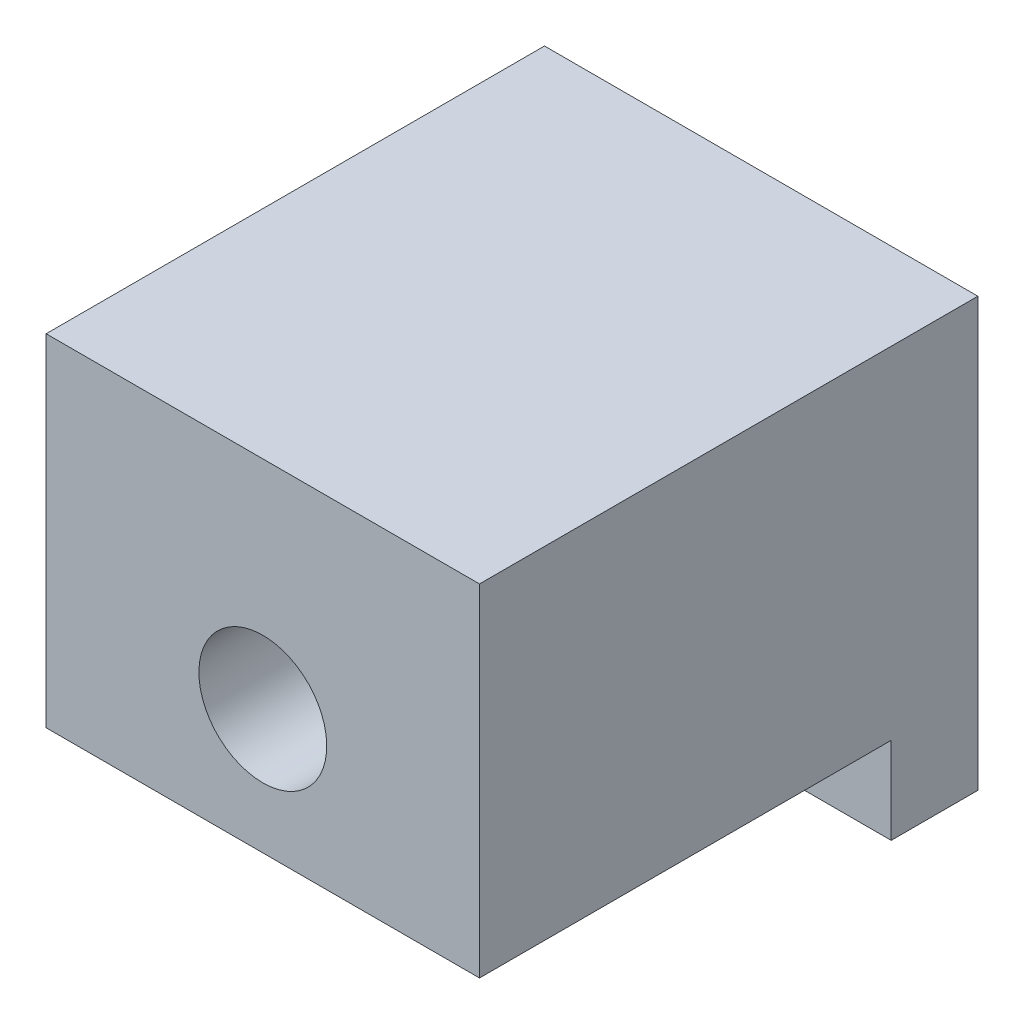
ISO-10303-21;
HEADER;
FILE_DESCRIPTION(('STEP AP214'),'2;1');
FILE_NAME('part.step','',(''),(''),'','','');
FILE_SCHEMA(('AUTOMOTIVE_DESIGN { 1 0 10303 214 1 1 1 1 }'));
ENDSEC;
DATA;
#1=APPLICATION_CONTEXT('core data for automotive mechanical design processes');
#2=APPLICATION_PROTOCOL_DEFINITION('international standard','automotive_design',2000,#1);
#3=PRODUCT_CONTEXT('',#1,'mechanical');
#4=PRODUCT('Part','Part','',(#3));
#5=PRODUCT_RELATED_PRODUCT_CATEGORY('part','',(#4));
#6=PRODUCT_DEFINITION_FORMATION('','',#4);
#7=PRODUCT_DEFINITION_CONTEXT('part definition',#1,'design');
#8=PRODUCT_DEFINITION('design','',#6,#7);
#9=PRODUCT_DEFINITION_SHAPE('','',#8);
#10=(LENGTH_UNIT() NAMED_UNIT(*) SI_UNIT(.MILLI.,.METRE.));
#11=(NAMED_UNIT(*) PLANE_ANGLE_UNIT() SI_UNIT($,.RADIAN.));
#12=(NAMED_UNIT(*) SI_UNIT($,.STERADIAN.) SOLID_ANGLE_UNIT());
#13=UNCERTAINTY_MEASURE_WITH_UNIT(LENGTH_MEASURE(1.E-05),#10,'distance_accuracy_value','');
#14=(GEOMETRIC_REPRESENTATION_CONTEXT(3) GLOBAL_UNCERTAINTY_ASSIGNED_CONTEXT((#13)) GLOBAL_UNIT_ASSIGNED_CONTEXT((#10,
#11,#12)) REPRESENTATION_CONTEXT('',''));
#15=CARTESIAN_POINT('',(0.,0.,0.));
#16=DIRECTION('',(0.,0.,1.));
#17=DIRECTION('',(1.,0.,0.));
#18=AXIS2_PLACEMENT_3D('',#15,#16,#17);
#19=CARTESIAN_POINT('',(-5.,46.5,2.));
#20=DIRECTION('',(0.,-1.,0.));
#21=DIRECTION('',(-1.,0.,0.));
#22=AXIS2_PLACEMENT_3D('',#19,#20,#21);
#23=PLANE('',#22);
#24=DIRECTION('',(1.,0.,0.));
#25=VECTOR('',#24,1.);
#26=CARTESIAN_POINT('',(-5.,46.5,11.5));
#27=LINE('',#26,#25);
#28=CARTESIAN_POINT('',(-5.,46.5,11.5));
#29=VERTEX_POINT('',#28);
#30=CARTESIAN_POINT('',(5.,46.5,11.5));
#31=VERTEX_POINT('',#30);
#32=EDGE_CURVE('E69',#29,#31,#27,.T.);
#33=ORIENTED_EDGE('',*,*,#32,.T.);
#34=DIRECTION('',(0.,0.,1.));
#35=VECTOR('',#34,1.);
#36=CARTESIAN_POINT('',(5.,46.5,2.));
#37=LINE('',#36,#35);
#38=CARTESIAN_POINT('',(5.,46.5,0.));
#39=VERTEX_POINT('',#38);
#40=EDGE_CURVE('E53',#39,#31,#37,.T.);
#41=ORIENTED_EDGE('',*,*,#40,.F.);
#42=DIRECTION('',(1.,0.,0.));
#43=VECTOR('',#42,1.);
#44=CARTESIAN_POINT('',(-5.,46.5,0.));
#45=LINE('',#44,#43);
#46=CARTESIAN_POINT('',(-5.,46.5,0.));
#47=VERTEX_POINT('',#46);
#48=EDGE_CURVE('E108',#47,#39,#45,.T.);
#49=ORIENTED_EDGE('',*,*,#48,.F.);
#50=DIRECTION('',(0.,0.,1.));
#51=VECTOR('',#50,1.);
#52=CARTESIAN_POINT('',(-5.,46.5,2.));
#53=LINE('',#52,#51);
#54=EDGE_CURVE('E11',#47,#29,#53,.T.);
#55=ORIENTED_EDGE('',*,*,#54,.T.);
#56=EDGE_LOOP('',(#33,#41,#49,#55));
#57=FACE_BOUND('',#56,.T.);
#58=ADVANCED_FACE('F44',(#57),#23,.F.);
#59=CARTESIAN_POINT('',(0.,11.5,11.5));
#60=DIRECTION('',(0.,0.,-1.));
#61=DIRECTION('',(0.,1.,0.));
#62=AXIS2_PLACEMENT_3D('',#59,#60,#61);
#63=PLANE('',#62);
#64=CARTESIAN_POINT('',(0.,41.5,11.5));
#65=DIRECTION('',(0.,0.,1.));
#66=DIRECTION('',(0.,-1.,0.));
#67=AXIS2_PLACEMENT_3D('',#64,#65,#66);
#68=CIRCLE('',#67,1.475);
#69=CARTESIAN_POINT('',(0.,40.025,11.5));
#70=VERTEX_POINT('',#69);
#71=EDGE_CURVE('E147',#70,#70,#68,.T.);
#72=ORIENTED_EDGE('',*,*,#71,.F.);
#73=EDGE_LOOP('',(#72));
#74=FACE_BOUND('',#73,.T.);
#75=DIRECTION('',(0.,1.,0.));
#76=VECTOR('',#75,1.);
#77=CARTESIAN_POINT('',(-5.,-23.5,11.5));
#78=LINE('',#77,#76);
#79=CARTESIAN_POINT('',(-5.00000000000001,38.625,11.5));
#80=VERTEX_POINT('',#79);
#81=EDGE_CURVE('E106',#80,#29,#78,.T.);
#82=ORIENTED_EDGE('',*,*,#81,.F.);
#83=DIRECTION('',(1.,0.,0.));
#84=VECTOR('',#83,1.);
#85=CARTESIAN_POINT('',(-5.00000000000001,38.625,11.5));
#86=LINE('',#85,#84);
#87=CARTESIAN_POINT('',(5.,38.625,11.5));
#88=VERTEX_POINT('',#87);
#89=EDGE_CURVE('E155',#80,#88,#86,.T.);
#90=ORIENTED_EDGE('',*,*,#89,.T.);
#91=DIRECTION('',(0.,-1.,0.));
#92=VECTOR('',#91,1.);
#93=CARTESIAN_POINT('',(5.,-23.5,11.5));
#94=LINE('',#93,#92);
#95=EDGE_CURVE('E156',#31,#88,#94,.T.);
#96=ORIENTED_EDGE('',*,*,#95,.F.);
#97=ORIENTED_EDGE('',*,*,#32,.F.);
#98=EDGE_LOOP('',(#82,#90,#96,#97));
#99=FACE_BOUND('',#98,.T.);
#100=ADVANCED_FACE('F175',(#74,#99),#63,.F.);
#101=CARTESIAN_POINT('',(-5.,-23.5,2.));
#102=DIRECTION('',(1.,0.,0.));
#103=DIRECTION('',(0.,-1.,0.));
#104=AXIS2_PLACEMENT_3D('',#101,#102,#103);
#105=PLANE('',#104);
#106=ORIENTED_EDGE('',*,*,#54,.F.);
#107=DIRECTION('',(0.,1.,0.));
#108=VECTOR('',#107,1.);
#109=CARTESIAN_POINT('',(-5.,46.5,0.));
#110=LINE('',#109,#108);
#111=CARTESIAN_POINT('',(-5.,36.625,0.));
#112=VERTEX_POINT('',#111);
#113=EDGE_CURVE('E101',#112,#47,#110,.T.);
#114=ORIENTED_EDGE('',*,*,#113,.F.);
#115=DIRECTION('',(0.,0.,1.));
#116=VECTOR('',#115,1.);
#117=CARTESIAN_POINT('',(-5.,36.625,0.));
#118=LINE('',#117,#116);
#119=CARTESIAN_POINT('',(-5.,36.625,2.));
#120=VERTEX_POINT('',#119);
#121=EDGE_CURVE('E133',#112,#120,#118,.T.);
#122=ORIENTED_EDGE('',*,*,#121,.T.);
#123=DIRECTION('',(0.,1.,0.));
#124=VECTOR('',#123,1.);
#125=CARTESIAN_POINT('',(-5.,46.5,2.));
#126=LINE('',#125,#124);
#127=CARTESIAN_POINT('',(-5.,38.625,2.));
#128=VERTEX_POINT('',#127);
#129=EDGE_CURVE('E135',#120,#128,#126,.T.);
#130=ORIENTED_EDGE('',*,*,#129,.T.);
#131=DIRECTION('',(0.,0.,1.));
#132=VECTOR('',#131,1.);
#133=CARTESIAN_POINT('',(-5.00000000000001,38.625,11.5));
#134=LINE('',#133,#132);
#135=EDGE_CURVE('E148',#128,#80,#134,.T.);
#136=ORIENTED_EDGE('',*,*,#135,.T.);
#137=ORIENTED_EDGE('',*,*,#81,.T.);
#138=EDGE_LOOP('',(#106,#114,#122,#130,#136,#137));
#139=FACE_BOUND('',#138,.T.);
#140=ADVANCED_FACE('F99',(#139),#105,.F.);
#141=CARTESIAN_POINT('',(5.,-23.5,2.));
#142=DIRECTION('',(-1.,0.,0.));
#143=DIRECTION('',(0.,1.,0.));
#144=AXIS2_PLACEMENT_3D('',#141,#142,#143);
#145=PLANE('',#144);
#146=ORIENTED_EDGE('',*,*,#95,.T.);
#147=DIRECTION('',(0.,0.,1.));
#148=VECTOR('',#147,1.);
#149=CARTESIAN_POINT('',(5.,38.625,11.5));
#150=LINE('',#149,#148);
#151=CARTESIAN_POINT('',(5.,38.625,2.));
#152=VERTEX_POINT('',#151);
#153=EDGE_CURVE('E62',#152,#88,#150,.T.);
#154=ORIENTED_EDGE('',*,*,#153,.F.);
#155=DIRECTION('',(0.,-1.,0.));
#156=VECTOR('',#155,1.);
#157=CARTESIAN_POINT('',(5.,46.5,2.));
#158=LINE('',#157,#156);
#159=CARTESIAN_POINT('',(5.,36.625,2.));
#160=VERTEX_POINT('',#159);
#161=EDGE_CURVE('E123',#152,#160,#158,.T.);
#162=ORIENTED_EDGE('',*,*,#161,.T.);
#163=DIRECTION('',(0.,0.,1.));
#164=VECTOR('',#163,1.);
#165=CARTESIAN_POINT('',(5.,36.625,0.));
#166=LINE('',#165,#164);
#167=CARTESIAN_POINT('',(5.,36.625,0.));
#168=VERTEX_POINT('',#167);
#169=EDGE_CURVE('E141',#168,#160,#166,.T.);
#170=ORIENTED_EDGE('',*,*,#169,.F.);
#171=DIRECTION('',(0.,-1.,0.));
#172=VECTOR('',#171,1.);
#173=CARTESIAN_POINT('',(5.,46.5,0.));
#174=LINE('',#173,#172);
#175=EDGE_CURVE('E115',#39,#168,#174,.T.);
#176=ORIENTED_EDGE('',*,*,#175,.F.);
#177=ORIENTED_EDGE('',*,*,#40,.T.);
#178=EDGE_LOOP('',(#146,#154,#162,#170,#176,#177));
#179=FACE_BOUND('',#178,.T.);
#180=ADVANCED_FACE('F50',(#179),#145,.F.);
#181=CARTESIAN_POINT('',(-5.00000000000001,38.625,11.5));
#182=DIRECTION('',(0.,1.,0.));
#183=DIRECTION('',(0.,0.,1.));
#184=AXIS2_PLACEMENT_3D('',#181,#182,#183);
#185=PLANE('',#184);
#186=ORIENTED_EDGE('',*,*,#153,.T.);
#187=ORIENTED_EDGE('',*,*,#89,.F.);
#188=ORIENTED_EDGE('',*,*,#135,.F.);
#189=DIRECTION('',(1.,0.,0.));
#190=VECTOR('',#189,1.);
#191=CARTESIAN_POINT('',(-5.00000000000001,38.625,2.));
#192=LINE('',#191,#190);
#193=EDGE_CURVE('E152',#128,#152,#192,.T.);
#194=ORIENTED_EDGE('',*,*,#193,.T.);
#195=EDGE_LOOP('',(#186,#187,#188,#194));
#196=FACE_BOUND('',#195,.T.);
#197=ADVANCED_FACE('F172',(#196),#185,.F.);
#198=CARTESIAN_POINT('',(0.,41.5,2.));
#199=DIRECTION('',(0.,0.,1.));
#200=DIRECTION('',(0.,-1.,0.));
#201=AXIS2_PLACEMENT_3D('',#198,#199,#200);
#202=CYLINDRICAL_SURFACE('',#201,1.475);
#203=ORIENTED_EDGE('',*,*,#71,.T.);
#204=EDGE_LOOP('',(#203));
#205=FACE_BOUND('',#204,.T.);
#206=CARTESIAN_POINT('',(0.,41.5,0.));
#207=DIRECTION('',(0.,0.,-1.));
#208=DIRECTION('',(0.,1.,0.));
#209=AXIS2_PLACEMENT_3D('',#206,#207,#208);
#210=CIRCLE('',#209,1.475);
#211=CARTESIAN_POINT('',(0.,42.975,0.));
#212=VERTEX_POINT('',#211);
#213=EDGE_CURVE('E129',#212,#212,#210,.T.);
#214=ORIENTED_EDGE('',*,*,#213,.T.);
#215=EDGE_LOOP('',(#214));
#216=FACE_BOUND('',#215,.T.);
#217=ADVANCED_FACE('F200',(#205,#216),#202,.F.);
#218=CARTESIAN_POINT('',(0.,11.5,2.));
#219=DIRECTION('',(0.,0.,1.));
#220=DIRECTION('',(0.,-1.,0.));
#221=AXIS2_PLACEMENT_3D('',#218,#219,#220);
#222=PLANE('',#221);
#223=ORIENTED_EDGE('',*,*,#193,.F.);
#224=ORIENTED_EDGE('',*,*,#129,.F.);
#225=DIRECTION('',(-1.,0.,0.));
#226=VECTOR('',#225,1.);
#227=CARTESIAN_POINT('',(-5.,36.625,2.));
#228=LINE('',#227,#226);
#229=EDGE_CURVE('E119',#160,#120,#228,.T.);
#230=ORIENTED_EDGE('',*,*,#229,.F.);
#231=ORIENTED_EDGE('',*,*,#161,.F.);
#232=EDGE_LOOP('',(#223,#224,#230,#231));
#233=FACE_BOUND('',#232,.T.);
#234=ADVANCED_FACE('F178',(#233),#222,.T.);
#235=CARTESIAN_POINT('',(0.,11.5,0.));
#236=DIRECTION('',(0.,0.,1.));
#237=DIRECTION('',(0.,-1.,0.));
#238=AXIS2_PLACEMENT_3D('',#235,#236,#237);
#239=PLANE('',#238);
#240=ORIENTED_EDGE('',*,*,#113,.T.);
#241=ORIENTED_EDGE('',*,*,#48,.T.);
#242=ORIENTED_EDGE('',*,*,#175,.T.);
#243=DIRECTION('',(-1.,0.,0.));
#244=VECTOR('',#243,1.);
#245=CARTESIAN_POINT('',(-5.,36.625,0.));
#246=LINE('',#245,#244);
#247=EDGE_CURVE('E120',#168,#112,#246,.T.);
#248=ORIENTED_EDGE('',*,*,#247,.T.);
#249=EDGE_LOOP('',(#240,#241,#242,#248));
#250=FACE_BOUND('',#249,.T.);
#251=ORIENTED_EDGE('',*,*,#213,.F.);
#252=EDGE_LOOP('',(#251));
#253=FACE_BOUND('',#252,.T.);
#254=ADVANCED_FACE('F112',(#250,#253),#239,.F.);
#255=CARTESIAN_POINT('',(-5.,36.625,0.));
#256=DIRECTION('',(0.,1.,0.));
#257=DIRECTION('',(1.,0.,0.));
#258=AXIS2_PLACEMENT_3D('',#255,#256,#257);
#259=PLANE('',#258);
#260=ORIENTED_EDGE('',*,*,#229,.T.);
#261=ORIENTED_EDGE('',*,*,#121,.F.);
#262=ORIENTED_EDGE('',*,*,#247,.F.);
#263=ORIENTED_EDGE('',*,*,#169,.T.);
#264=EDGE_LOOP('',(#260,#261,#262,#263));
#265=FACE_BOUND('',#264,.T.);
#266=ADVANCED_FACE('F179',(#265),#259,.F.);
#267=CLOSED_SHELL('',(#58,#100,#140,#180,#197,#217,#234,#254,#266));
#268=MANIFOLD_SOLID_BREP('B2',#267);
#269=ADVANCED_BREP_SHAPE_REPRESENTATION('',(#18,#268),#14);
#270=SHAPE_DEFINITION_REPRESENTATION(#9,#269);
ENDSEC;
END-ISO-10303-21;
